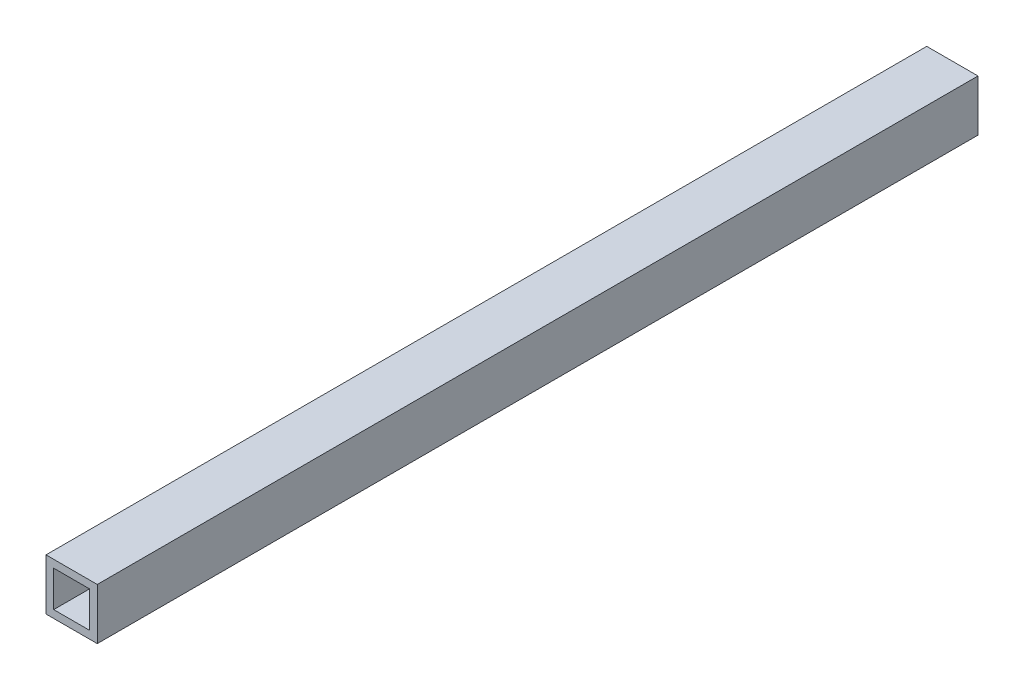
ISO-10303-21;
HEADER;
FILE_DESCRIPTION(('STEP AP214'),'2;1');
FILE_NAME('part.step','',(''),(''),'','','');
FILE_SCHEMA(('AUTOMOTIVE_DESIGN { 1 0 10303 214 1 1 1 1 }'));
ENDSEC;
DATA;
#1=APPLICATION_CONTEXT('core data for automotive mechanical design processes');
#2=APPLICATION_PROTOCOL_DEFINITION('international standard','automotive_design',2000,#1);
#3=PRODUCT_CONTEXT('',#1,'mechanical');
#4=PRODUCT('Part','Part','',(#3));
#5=PRODUCT_RELATED_PRODUCT_CATEGORY('part','',(#4));
#6=PRODUCT_DEFINITION_FORMATION('','',#4);
#7=PRODUCT_DEFINITION_CONTEXT('part definition',#1,'design');
#8=PRODUCT_DEFINITION('design','',#6,#7);
#9=PRODUCT_DEFINITION_SHAPE('','',#8);
#10=(LENGTH_UNIT() NAMED_UNIT(*) SI_UNIT(.MILLI.,.METRE.));
#11=(NAMED_UNIT(*) PLANE_ANGLE_UNIT() SI_UNIT($,.RADIAN.));
#12=(NAMED_UNIT(*) SI_UNIT($,.STERADIAN.) SOLID_ANGLE_UNIT());
#13=UNCERTAINTY_MEASURE_WITH_UNIT(LENGTH_MEASURE(1.E-05),#10,'distance_accuracy_value','');
#14=(GEOMETRIC_REPRESENTATION_CONTEXT(3) GLOBAL_UNCERTAINTY_ASSIGNED_CONTEXT((#13)) GLOBAL_UNIT_ASSIGNED_CONTEXT((#10,
#11,#12)) REPRESENTATION_CONTEXT('',''));
#15=CARTESIAN_POINT('',(0.,0.,0.));
#16=DIRECTION('',(0.,0.,1.));
#17=DIRECTION('',(1.,0.,0.));
#18=AXIS2_PLACEMENT_3D('',#15,#16,#17);
#19=CARTESIAN_POINT('',(0.,0.,171.8));
#20=DIRECTION('',(0.,0.,1.));
#21=DIRECTION('',(1.,0.,0.));
#22=AXIS2_PLACEMENT_3D('',#19,#20,#21);
#23=PLANE('',#22);
#24=DIRECTION('',(0.,1.,0.));
#25=VECTOR('',#24,1.);
#26=CARTESIAN_POINT('',(5.,5.,171.8));
#27=LINE('',#26,#25);
#28=CARTESIAN_POINT('',(5.,-5.,171.8));
#29=VERTEX_POINT('',#28);
#30=CARTESIAN_POINT('',(5.,5.,171.8));
#31=VERTEX_POINT('',#30);
#32=EDGE_CURVE('E133',#29,#31,#27,.T.);
#33=ORIENTED_EDGE('',*,*,#32,.T.);
#34=DIRECTION('',(-1.,0.,0.));
#35=VECTOR('',#34,1.);
#36=CARTESIAN_POINT('',(-5.,5.,171.8));
#37=LINE('',#36,#35);
#38=CARTESIAN_POINT('',(-5.,5.,171.8));
#39=VERTEX_POINT('',#38);
#40=EDGE_CURVE('E136',#31,#39,#37,.T.);
#41=ORIENTED_EDGE('',*,*,#40,.T.);
#42=DIRECTION('',(0.,-1.,0.));
#43=VECTOR('',#42,1.);
#44=CARTESIAN_POINT('',(-5.,5.,171.8));
#45=LINE('',#44,#43);
#46=CARTESIAN_POINT('',(-5.,-5.,171.8));
#47=VERTEX_POINT('',#46);
#48=EDGE_CURVE('E139',#39,#47,#45,.T.);
#49=ORIENTED_EDGE('',*,*,#48,.T.);
#50=DIRECTION('',(1.,0.,0.));
#51=VECTOR('',#50,1.);
#52=CARTESIAN_POINT('',(-5.,-5.,171.8));
#53=LINE('',#52,#51);
#54=EDGE_CURVE('E141',#47,#29,#53,.T.);
#55=ORIENTED_EDGE('',*,*,#54,.T.);
#56=EDGE_LOOP('',(#33,#41,#49,#55));
#57=FACE_BOUND('',#56,.T.);
#58=DIRECTION('',(-1.,0.,0.));
#59=VECTOR('',#58,1.);
#60=CARTESIAN_POINT('',(-3.5,3.5,171.8));
#61=LINE('',#60,#59);
#62=CARTESIAN_POINT('',(3.5,3.5,171.8));
#63=VERTEX_POINT('',#62);
#64=CARTESIAN_POINT('',(-3.5,3.5,171.8));
#65=VERTEX_POINT('',#64);
#66=EDGE_CURVE('E105',#63,#65,#61,.T.);
#67=ORIENTED_EDGE('',*,*,#66,.F.);
#68=DIRECTION('',(0.,1.,0.));
#69=VECTOR('',#68,1.);
#70=CARTESIAN_POINT('',(3.5,-3.5,171.8));
#71=LINE('',#70,#69);
#72=CARTESIAN_POINT('',(3.5,-3.5,171.8));
#73=VERTEX_POINT('',#72);
#74=EDGE_CURVE('E97',#73,#63,#71,.T.);
#75=ORIENTED_EDGE('',*,*,#74,.F.);
#76=DIRECTION('',(1.,0.,0.));
#77=VECTOR('',#76,1.);
#78=CARTESIAN_POINT('',(-3.5,-3.5,171.8));
#79=LINE('',#78,#77);
#80=CARTESIAN_POINT('',(-3.5,-3.5,171.8));
#81=VERTEX_POINT('',#80);
#82=EDGE_CURVE('E119',#81,#73,#79,.T.);
#83=ORIENTED_EDGE('',*,*,#82,.F.);
#84=DIRECTION('',(0.,-1.,0.));
#85=VECTOR('',#84,1.);
#86=CARTESIAN_POINT('',(-3.5,-3.5,171.8));
#87=LINE('',#86,#85);
#88=EDGE_CURVE('E117',#65,#81,#87,.T.);
#89=ORIENTED_EDGE('',*,*,#88,.F.);
#90=EDGE_LOOP('',(#67,#75,#83,#89));
#91=FACE_BOUND('',#90,.T.);
#92=ADVANCED_FACE('F32',(#57,#91),#23,.T.);
#93=CARTESIAN_POINT('',(0.,0.,0.));
#94=DIRECTION('',(0.,0.,1.));
#95=DIRECTION('',(1.,0.,0.));
#96=AXIS2_PLACEMENT_3D('',#93,#94,#95);
#97=PLANE('',#96);
#98=DIRECTION('',(0.,1.,0.));
#99=VECTOR('',#98,1.);
#100=CARTESIAN_POINT('',(5.,5.,0.));
#101=LINE('',#100,#99);
#102=CARTESIAN_POINT('',(5.,-5.,0.));
#103=VERTEX_POINT('',#102);
#104=CARTESIAN_POINT('',(5.,5.,0.));
#105=VERTEX_POINT('',#104);
#106=EDGE_CURVE('E113',#103,#105,#101,.T.);
#107=ORIENTED_EDGE('',*,*,#106,.F.);
#108=DIRECTION('',(1.,0.,0.));
#109=VECTOR('',#108,1.);
#110=CARTESIAN_POINT('',(-5.,-5.,0.));
#111=LINE('',#110,#109);
#112=CARTESIAN_POINT('',(-5.,-5.,0.));
#113=VERTEX_POINT('',#112);
#114=EDGE_CURVE('E137',#113,#103,#111,.T.);
#115=ORIENTED_EDGE('',*,*,#114,.F.);
#116=DIRECTION('',(0.,-1.,0.));
#117=VECTOR('',#116,1.);
#118=CARTESIAN_POINT('',(-5.,5.,0.));
#119=LINE('',#118,#117);
#120=CARTESIAN_POINT('',(-5.,5.,0.));
#121=VERTEX_POINT('',#120);
#122=EDGE_CURVE('E148',#121,#113,#119,.T.);
#123=ORIENTED_EDGE('',*,*,#122,.F.);
#124=DIRECTION('',(-1.,0.,0.));
#125=VECTOR('',#124,1.);
#126=CARTESIAN_POINT('',(-5.,5.,0.));
#127=LINE('',#126,#125);
#128=EDGE_CURVE('E146',#105,#121,#127,.T.);
#129=ORIENTED_EDGE('',*,*,#128,.F.);
#130=EDGE_LOOP('',(#107,#115,#123,#129));
#131=FACE_BOUND('',#130,.T.);
#132=DIRECTION('',(0.,1.,0.));
#133=VECTOR('',#132,1.);
#134=CARTESIAN_POINT('',(3.5,-3.5,0.));
#135=LINE('',#134,#133);
#136=CARTESIAN_POINT('',(3.5,-3.5,0.));
#137=VERTEX_POINT('',#136);
#138=CARTESIAN_POINT('',(3.5,3.5,0.));
#139=VERTEX_POINT('',#138);
#140=EDGE_CURVE('E55',#137,#139,#135,.T.);
#141=ORIENTED_EDGE('',*,*,#140,.T.);
#142=DIRECTION('',(-1.,0.,0.));
#143=VECTOR('',#142,1.);
#144=CARTESIAN_POINT('',(-3.5,3.5,0.));
#145=LINE('',#144,#143);
#146=CARTESIAN_POINT('',(-3.5,3.5,0.));
#147=VERTEX_POINT('',#146);
#148=EDGE_CURVE('E112',#139,#147,#145,.T.);
#149=ORIENTED_EDGE('',*,*,#148,.T.);
#150=DIRECTION('',(0.,-1.,0.));
#151=VECTOR('',#150,1.);
#152=CARTESIAN_POINT('',(-3.5,-3.5,0.));
#153=LINE('',#152,#151);
#154=CARTESIAN_POINT('',(-3.5,-3.5,0.));
#155=VERTEX_POINT('',#154);
#156=EDGE_CURVE('E125',#147,#155,#153,.T.);
#157=ORIENTED_EDGE('',*,*,#156,.T.);
#158=DIRECTION('',(1.,0.,0.));
#159=VECTOR('',#158,1.);
#160=CARTESIAN_POINT('',(-3.5,-3.5,0.));
#161=LINE('',#160,#159);
#162=EDGE_CURVE('E106',#155,#137,#161,.T.);
#163=ORIENTED_EDGE('',*,*,#162,.T.);
#164=EDGE_LOOP('',(#141,#149,#157,#163));
#165=FACE_BOUND('',#164,.T.);
#166=ADVANCED_FACE('F166',(#131,#165),#97,.F.);
#167=CARTESIAN_POINT('',(5.,5.,171.8));
#168=DIRECTION('',(-1.,0.,0.));
#169=DIRECTION('',(0.,-1.,0.));
#170=AXIS2_PLACEMENT_3D('',#167,#168,#169);
#171=PLANE('',#170);
#172=ORIENTED_EDGE('',*,*,#106,.T.);
#173=DIRECTION('',(0.,0.,-1.));
#174=VECTOR('',#173,1.);
#175=CARTESIAN_POINT('',(5.,5.,171.8));
#176=LINE('',#175,#174);
#177=EDGE_CURVE('E11',#31,#105,#176,.T.);
#178=ORIENTED_EDGE('',*,*,#177,.F.);
#179=ORIENTED_EDGE('',*,*,#32,.F.);
#180=DIRECTION('',(0.,0.,-1.));
#181=VECTOR('',#180,1.);
#182=CARTESIAN_POINT('',(5.,-5.,171.8));
#183=LINE('',#182,#181);
#184=EDGE_CURVE('E143',#29,#103,#183,.T.);
#185=ORIENTED_EDGE('',*,*,#184,.T.);
#186=EDGE_LOOP('',(#172,#178,#179,#185));
#187=FACE_BOUND('',#186,.T.);
#188=ADVANCED_FACE('F34',(#187),#171,.F.);
#189=CARTESIAN_POINT('',(-5.,5.,171.8));
#190=DIRECTION('',(0.,-1.,0.));
#191=DIRECTION('',(0.,0.,-1.));
#192=AXIS2_PLACEMENT_3D('',#189,#190,#191);
#193=PLANE('',#192);
#194=ORIENTED_EDGE('',*,*,#128,.T.);
#195=DIRECTION('',(0.,0.,-1.));
#196=VECTOR('',#195,1.);
#197=CARTESIAN_POINT('',(-5.,5.,171.8));
#198=LINE('',#197,#196);
#199=EDGE_CURVE('E40',#39,#121,#198,.T.);
#200=ORIENTED_EDGE('',*,*,#199,.F.);
#201=ORIENTED_EDGE('',*,*,#40,.F.);
#202=ORIENTED_EDGE('',*,*,#177,.T.);
#203=EDGE_LOOP('',(#194,#200,#201,#202));
#204=FACE_BOUND('',#203,.T.);
#205=ADVANCED_FACE('F176',(#204),#193,.F.);
#206=CARTESIAN_POINT('',(-5.,5.,171.8));
#207=DIRECTION('',(1.,0.,0.));
#208=DIRECTION('',(0.,1.,0.));
#209=AXIS2_PLACEMENT_3D('',#206,#207,#208);
#210=PLANE('',#209);
#211=ORIENTED_EDGE('',*,*,#122,.T.);
#212=DIRECTION('',(0.,0.,-1.));
#213=VECTOR('',#212,1.);
#214=CARTESIAN_POINT('',(-5.,-5.,171.8));
#215=LINE('',#214,#213);
#216=EDGE_CURVE('E153',#47,#113,#215,.T.);
#217=ORIENTED_EDGE('',*,*,#216,.F.);
#218=ORIENTED_EDGE('',*,*,#48,.F.);
#219=ORIENTED_EDGE('',*,*,#199,.T.);
#220=EDGE_LOOP('',(#211,#217,#218,#219));
#221=FACE_BOUND('',#220,.T.);
#222=ADVANCED_FACE('F160',(#221),#210,.F.);
#223=CARTESIAN_POINT('',(-5.,-5.,171.8));
#224=DIRECTION('',(0.,1.,0.));
#225=DIRECTION('',(0.,0.,1.));
#226=AXIS2_PLACEMENT_3D('',#223,#224,#225);
#227=PLANE('',#226);
#228=ORIENTED_EDGE('',*,*,#114,.T.);
#229=ORIENTED_EDGE('',*,*,#184,.F.);
#230=ORIENTED_EDGE('',*,*,#54,.F.);
#231=ORIENTED_EDGE('',*,*,#216,.T.);
#232=EDGE_LOOP('',(#228,#229,#230,#231));
#233=FACE_BOUND('',#232,.T.);
#234=ADVANCED_FACE('F170',(#233),#227,.F.);
#235=CARTESIAN_POINT('',(3.5,-3.5,171.8));
#236=DIRECTION('',(-1.,0.,0.));
#237=DIRECTION('',(0.,0.,1.));
#238=AXIS2_PLACEMENT_3D('',#235,#236,#237);
#239=PLANE('',#238);
#240=ORIENTED_EDGE('',*,*,#140,.F.);
#241=DIRECTION('',(0.,0.,-1.));
#242=VECTOR('',#241,1.);
#243=CARTESIAN_POINT('',(3.5,-3.5,171.8));
#244=LINE('',#243,#242);
#245=EDGE_CURVE('E101',#73,#137,#244,.T.);
#246=ORIENTED_EDGE('',*,*,#245,.F.);
#247=ORIENTED_EDGE('',*,*,#74,.T.);
#248=DIRECTION('',(0.,0.,-1.));
#249=VECTOR('',#248,1.);
#250=CARTESIAN_POINT('',(3.5,3.5,171.8));
#251=LINE('',#250,#249);
#252=EDGE_CURVE('E100',#63,#139,#251,.T.);
#253=ORIENTED_EDGE('',*,*,#252,.T.);
#254=EDGE_LOOP('',(#240,#246,#247,#253));
#255=FACE_BOUND('',#254,.T.);
#256=ADVANCED_FACE('F99',(#255),#239,.T.);
#257=CARTESIAN_POINT('',(-3.5,3.5,171.8));
#258=DIRECTION('',(0.,-1.,0.));
#259=DIRECTION('',(0.,0.,-1.));
#260=AXIS2_PLACEMENT_3D('',#257,#258,#259);
#261=PLANE('',#260);
#262=ORIENTED_EDGE('',*,*,#148,.F.);
#263=ORIENTED_EDGE('',*,*,#252,.F.);
#264=ORIENTED_EDGE('',*,*,#66,.T.);
#265=DIRECTION('',(0.,0.,-1.));
#266=VECTOR('',#265,1.);
#267=CARTESIAN_POINT('',(-3.5,3.5,171.8));
#268=LINE('',#267,#266);
#269=EDGE_CURVE('E114',#65,#147,#268,.T.);
#270=ORIENTED_EDGE('',*,*,#269,.T.);
#271=EDGE_LOOP('',(#262,#263,#264,#270));
#272=FACE_BOUND('',#271,.T.);
#273=ADVANCED_FACE('F109',(#272),#261,.T.);
#274=CARTESIAN_POINT('',(-3.5,-3.5,171.8));
#275=DIRECTION('',(1.,0.,0.));
#276=DIRECTION('',(0.,0.,-1.));
#277=AXIS2_PLACEMENT_3D('',#274,#275,#276);
#278=PLANE('',#277);
#279=ORIENTED_EDGE('',*,*,#156,.F.);
#280=ORIENTED_EDGE('',*,*,#269,.F.);
#281=ORIENTED_EDGE('',*,*,#88,.T.);
#282=DIRECTION('',(0.,0.,-1.));
#283=VECTOR('',#282,1.);
#284=CARTESIAN_POINT('',(-3.5,-3.5,171.8));
#285=LINE('',#284,#283);
#286=EDGE_CURVE('E47',#81,#155,#285,.T.);
#287=ORIENTED_EDGE('',*,*,#286,.T.);
#288=EDGE_LOOP('',(#279,#280,#281,#287));
#289=FACE_BOUND('',#288,.T.);
#290=ADVANCED_FACE('F199',(#289),#278,.T.);
#291=CARTESIAN_POINT('',(-3.5,-3.5,171.8));
#292=DIRECTION('',(0.,1.,0.));
#293=DIRECTION('',(0.,0.,1.));
#294=AXIS2_PLACEMENT_3D('',#291,#292,#293);
#295=PLANE('',#294);
#296=ORIENTED_EDGE('',*,*,#162,.F.);
#297=ORIENTED_EDGE('',*,*,#286,.F.);
#298=ORIENTED_EDGE('',*,*,#82,.T.);
#299=ORIENTED_EDGE('',*,*,#245,.T.);
#300=EDGE_LOOP('',(#296,#297,#298,#299));
#301=FACE_BOUND('',#300,.T.);
#302=ADVANCED_FACE('F203',(#301),#295,.T.);
#303=CLOSED_SHELL('',(#92,#166,#188,#205,#222,#234,#256,#273,#290,#302));
#304=MANIFOLD_SOLID_BREP('B2',#303);
#305=ADVANCED_BREP_SHAPE_REPRESENTATION('',(#18,#304),#14);
#306=SHAPE_DEFINITION_REPRESENTATION(#9,#305);
ENDSEC;
END-ISO-10303-21;
